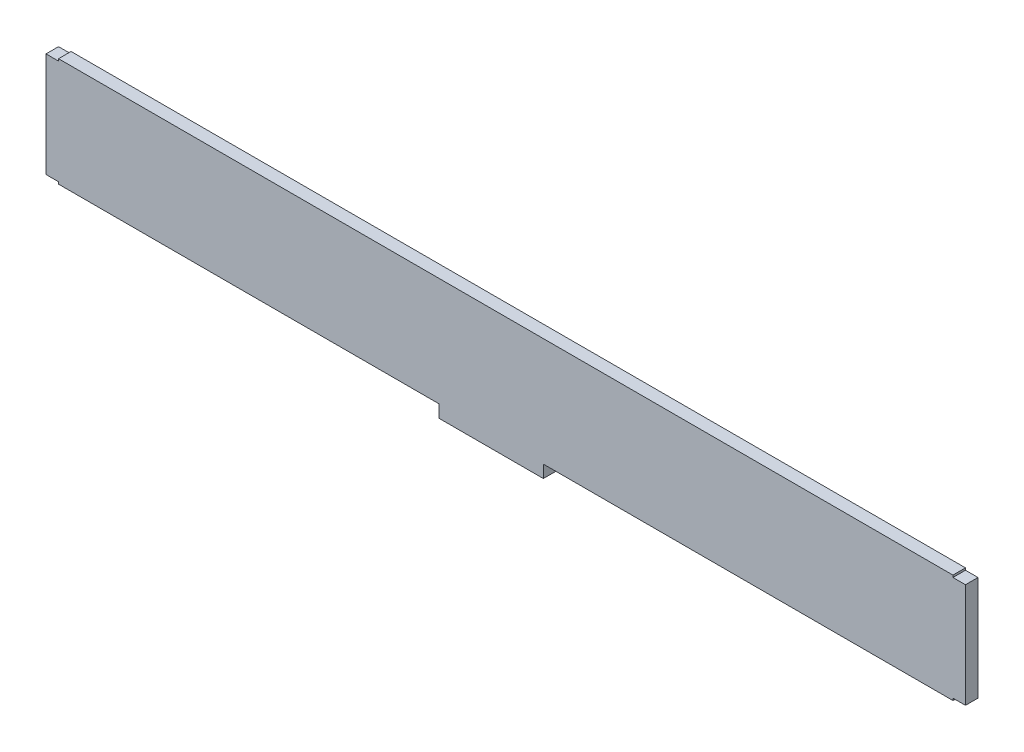
ISO-10303-21;
HEADER;
FILE_DESCRIPTION(('STEP AP214'),'2;1');
FILE_NAME('part.step','',(''),(''),'','','');
FILE_SCHEMA(('AUTOMOTIVE_DESIGN { 1 0 10303 214 1 1 1 1 }'));
ENDSEC;
DATA;
#1=APPLICATION_CONTEXT('core data for automotive mechanical design processes');
#2=APPLICATION_PROTOCOL_DEFINITION('international standard','automotive_design',2000,#1);
#3=PRODUCT_CONTEXT('',#1,'mechanical');
#4=PRODUCT('Part','Part','',(#3));
#5=PRODUCT_RELATED_PRODUCT_CATEGORY('part','',(#4));
#6=PRODUCT_DEFINITION_FORMATION('','',#4);
#7=PRODUCT_DEFINITION_CONTEXT('part definition',#1,'design');
#8=PRODUCT_DEFINITION('design','',#6,#7);
#9=PRODUCT_DEFINITION_SHAPE('','',#8);
#10=(LENGTH_UNIT() NAMED_UNIT(*) SI_UNIT(.MILLI.,.METRE.));
#11=(NAMED_UNIT(*) PLANE_ANGLE_UNIT() SI_UNIT($,.RADIAN.));
#12=(NAMED_UNIT(*) SI_UNIT($,.STERADIAN.) SOLID_ANGLE_UNIT());
#13=UNCERTAINTY_MEASURE_WITH_UNIT(LENGTH_MEASURE(1.E-05),#10,'distance_accuracy_value','');
#14=(GEOMETRIC_REPRESENTATION_CONTEXT(3) GLOBAL_UNCERTAINTY_ASSIGNED_CONTEXT((#13)) GLOBAL_UNIT_ASSIGNED_CONTEXT((#10,
#11,#12)) REPRESENTATION_CONTEXT('',''));
#15=CARTESIAN_POINT('',(0.,0.,0.));
#16=DIRECTION('',(0.,0.,1.));
#17=DIRECTION('',(1.,0.,0.));
#18=AXIS2_PLACEMENT_3D('',#15,#16,#17);
#19=CARTESIAN_POINT('',(0.,0.,6.));
#20=DIRECTION('',(1.,0.,0.));
#21=DIRECTION('',(0.,0.,-1.));
#22=AXIS2_PLACEMENT_3D('',#19,#20,#21);
#23=PLANE('',#22);
#24=DIRECTION('',(0.,-1.,0.));
#25=VECTOR('',#24,1.);
#26=CARTESIAN_POINT('',(0.,0.,0.));
#27=LINE('',#26,#25);
#28=CARTESIAN_POINT('',(0.,0.,0.));
#29=VERTEX_POINT('',#28);
#30=CARTESIAN_POINT('',(0.,-0.999999999999997,0.));
#31=VERTEX_POINT('',#30);
#32=EDGE_CURVE('E179',#29,#31,#27,.T.);
#33=ORIENTED_EDGE('',*,*,#32,.T.);
#34=DIRECTION('',(0.,0.,-1.));
#35=VECTOR('',#34,1.);
#36=CARTESIAN_POINT('',(0.,-0.999999999999997,6.));
#37=LINE('',#36,#35);
#38=CARTESIAN_POINT('',(0.,-0.999999999999997,6.));
#39=VERTEX_POINT('',#38);
#40=EDGE_CURVE('E11',#39,#31,#37,.T.);
#41=ORIENTED_EDGE('',*,*,#40,.F.);
#42=DIRECTION('',(0.,-1.,0.));
#43=VECTOR('',#42,1.);
#44=CARTESIAN_POINT('',(0.,0.,6.));
#45=LINE('',#44,#43);
#46=CARTESIAN_POINT('',(0.,0.,6.));
#47=VERTEX_POINT('',#46);
#48=EDGE_CURVE('E209',#47,#39,#45,.T.);
#49=ORIENTED_EDGE('',*,*,#48,.F.);
#50=DIRECTION('',(0.,0.,-1.));
#51=VECTOR('',#50,1.);
#52=CARTESIAN_POINT('',(0.,0.,6.));
#53=LINE('',#52,#51);
#54=EDGE_CURVE('E175',#47,#29,#53,.T.);
#55=ORIENTED_EDGE('',*,*,#54,.T.);
#56=EDGE_LOOP('',(#33,#41,#49,#55));
#57=FACE_BOUND('',#56,.T.);
#58=ADVANCED_FACE('F35',(#57),#23,.F.);
#59=CARTESIAN_POINT('',(-5.99999999999999,-0.999999999999945,6.));
#60=DIRECTION('',(0.,-1.,0.));
#61=DIRECTION('',(1.,0.,0.));
#62=AXIS2_PLACEMENT_3D('',#59,#60,#61);
#63=PLANE('',#62);
#64=DIRECTION('',(-1.,0.,0.));
#65=VECTOR('',#64,1.);
#66=CARTESIAN_POINT('',(-5.99999999999999,-0.999999999999945,0.));
#67=LINE('',#66,#65);
#68=CARTESIAN_POINT('',(-5.99999999999999,-0.999999999999945,0.));
#69=VERTEX_POINT('',#68);
#70=EDGE_CURVE('E182',#31,#69,#67,.T.);
#71=ORIENTED_EDGE('',*,*,#70,.T.);
#72=DIRECTION('',(0.,0.,-1.));
#73=VECTOR('',#72,1.);
#74=CARTESIAN_POINT('',(-5.99999999999999,-0.999999999999945,6.));
#75=LINE('',#74,#73);
#76=CARTESIAN_POINT('',(-5.99999999999999,-0.999999999999945,6.));
#77=VERTEX_POINT('',#76);
#78=EDGE_CURVE('E43',#77,#69,#75,.T.);
#79=ORIENTED_EDGE('',*,*,#78,.F.);
#80=DIRECTION('',(-1.,0.,0.));
#81=VECTOR('',#80,1.);
#82=CARTESIAN_POINT('',(-5.99999999999999,-0.999999999999945,6.));
#83=LINE('',#82,#81);
#84=EDGE_CURVE('E118',#39,#77,#83,.T.);
#85=ORIENTED_EDGE('',*,*,#84,.F.);
#86=ORIENTED_EDGE('',*,*,#40,.T.);
#87=EDGE_LOOP('',(#71,#79,#85,#86));
#88=FACE_BOUND('',#87,.T.);
#89=ADVANCED_FACE('F307',(#88),#63,.F.);
#90=CARTESIAN_POINT('',(-5.99999999999999,-0.999999999999945,6.));
#91=DIRECTION('',(1.,0.,0.));
#92=DIRECTION('',(0.,1.,0.));
#93=AXIS2_PLACEMENT_3D('',#90,#91,#92);
#94=PLANE('',#93);
#95=DIRECTION('',(0.,-1.,0.));
#96=VECTOR('',#95,1.);
#97=CARTESIAN_POINT('',(-5.99999999999999,-0.999999999999945,0.));
#98=LINE('',#97,#96);
#99=CARTESIAN_POINT('',(-5.99999999999999,-51.,0.));
#100=VERTEX_POINT('',#99);
#101=EDGE_CURVE('E184',#69,#100,#98,.T.);
#102=ORIENTED_EDGE('',*,*,#101,.T.);
#103=DIRECTION('',(0.,0.,-1.));
#104=VECTOR('',#103,1.);
#105=CARTESIAN_POINT('',(-5.99999999999999,-51.,6.));
#106=LINE('',#105,#104);
#107=CARTESIAN_POINT('',(-5.99999999999999,-51.,6.));
#108=VERTEX_POINT('',#107);
#109=EDGE_CURVE('E240',#108,#100,#106,.T.);
#110=ORIENTED_EDGE('',*,*,#109,.F.);
#111=DIRECTION('',(0.,-1.,0.));
#112=VECTOR('',#111,1.);
#113=CARTESIAN_POINT('',(-5.99999999999999,-0.999999999999945,6.));
#114=LINE('',#113,#112);
#115=EDGE_CURVE('E248',#77,#108,#114,.T.);
#116=ORIENTED_EDGE('',*,*,#115,.F.);
#117=ORIENTED_EDGE('',*,*,#78,.T.);
#118=EDGE_LOOP('',(#102,#110,#116,#117));
#119=FACE_BOUND('',#118,.T.);
#120=ADVANCED_FACE('F246',(#119),#94,.F.);
#121=CARTESIAN_POINT('',(-5.99999999999999,-51.,6.));
#122=DIRECTION('',(0.,1.,0.));
#123=DIRECTION('',(-1.,0.,0.));
#124=AXIS2_PLACEMENT_3D('',#121,#122,#123);
#125=PLANE('',#124);
#126=DIRECTION('',(1.,0.,0.));
#127=VECTOR('',#126,1.);
#128=CARTESIAN_POINT('',(-5.99999999999999,-51.,0.));
#129=LINE('',#128,#127);
#130=CARTESIAN_POINT('',(0.,-51.,0.));
#131=VERTEX_POINT('',#130);
#132=EDGE_CURVE('E186',#100,#131,#129,.T.);
#133=ORIENTED_EDGE('',*,*,#132,.T.);
#134=DIRECTION('',(0.,0.,-1.));
#135=VECTOR('',#134,1.);
#136=CARTESIAN_POINT('',(0.,-51.,6.));
#137=LINE('',#136,#135);
#138=CARTESIAN_POINT('',(0.,-51.,6.));
#139=VERTEX_POINT('',#138);
#140=EDGE_CURVE('E237',#139,#131,#137,.T.);
#141=ORIENTED_EDGE('',*,*,#140,.F.);
#142=DIRECTION('',(1.,0.,0.));
#143=VECTOR('',#142,1.);
#144=CARTESIAN_POINT('',(-5.99999999999999,-51.,6.));
#145=LINE('',#144,#143);
#146=EDGE_CURVE('E266',#108,#139,#145,.T.);
#147=ORIENTED_EDGE('',*,*,#146,.F.);
#148=ORIENTED_EDGE('',*,*,#109,.T.);
#149=EDGE_LOOP('',(#133,#141,#147,#148));
#150=FACE_BOUND('',#149,.T.);
#151=ADVANCED_FACE('F257',(#150),#125,.F.);
#152=CARTESIAN_POINT('',(0.,-51.,6.));
#153=DIRECTION('',(1.,1.19594830056547E-13,0.));
#154=DIRECTION('',(-1.19594830056547E-13,1.,0.));
#155=AXIS2_PLACEMENT_3D('',#152,#153,#154);
#156=PLANE('',#155);
#157=DIRECTION('',(1.19594830056547E-13,-1.,0.));
#158=VECTOR('',#157,1.);
#159=CARTESIAN_POINT('',(0.,-51.,0.));
#160=LINE('',#159,#158);
#161=CARTESIAN_POINT('',(0.,-52.,0.));
#162=VERTEX_POINT('',#161);
#163=EDGE_CURVE('E188',#131,#162,#160,.T.);
#164=ORIENTED_EDGE('',*,*,#163,.T.);
#165=DIRECTION('',(0.,0.,-1.));
#166=VECTOR('',#165,1.);
#167=CARTESIAN_POINT('',(0.,-52.,6.));
#168=LINE('',#167,#166);
#169=CARTESIAN_POINT('',(0.,-52.,6.));
#170=VERTEX_POINT('',#169);
#171=EDGE_CURVE('E234',#170,#162,#168,.T.);
#172=ORIENTED_EDGE('',*,*,#171,.F.);
#173=DIRECTION('',(1.19594830056547E-13,-1.,0.));
#174=VECTOR('',#173,1.);
#175=CARTESIAN_POINT('',(0.,-51.,6.));
#176=LINE('',#175,#174);
#177=EDGE_CURVE('E263',#139,#170,#176,.T.);
#178=ORIENTED_EDGE('',*,*,#177,.F.);
#179=ORIENTED_EDGE('',*,*,#140,.T.);
#180=EDGE_LOOP('',(#164,#172,#178,#179));
#181=FACE_BOUND('',#180,.T.);
#182=ADVANCED_FACE('F261',(#181),#156,.F.);
#183=CARTESIAN_POINT('',(0.,-52.,6.));
#184=DIRECTION('',(0.,1.,0.));
#185=DIRECTION('',(0.,0.,1.));
#186=AXIS2_PLACEMENT_3D('',#183,#184,#185);
#187=PLANE('',#186);
#188=DIRECTION('',(1.,0.,0.));
#189=VECTOR('',#188,1.);
#190=CARTESIAN_POINT('',(0.,-52.,0.));
#191=LINE('',#190,#189);
#192=CARTESIAN_POINT('',(182.,-52.,0.));
#193=VERTEX_POINT('',#192);
#194=EDGE_CURVE('E190',#162,#193,#191,.T.);
#195=ORIENTED_EDGE('',*,*,#194,.T.);
#196=DIRECTION('',(0.,0.,-1.));
#197=VECTOR('',#196,1.);
#198=CARTESIAN_POINT('',(182.,-52.,6.));
#199=LINE('',#198,#197);
#200=CARTESIAN_POINT('',(182.,-52.,6.));
#201=VERTEX_POINT('',#200);
#202=EDGE_CURVE('E231',#201,#193,#199,.T.);
#203=ORIENTED_EDGE('',*,*,#202,.F.);
#204=DIRECTION('',(1.,0.,0.));
#205=VECTOR('',#204,1.);
#206=CARTESIAN_POINT('',(0.,-52.,6.));
#207=LINE('',#206,#205);
#208=EDGE_CURVE('E265',#170,#201,#207,.T.);
#209=ORIENTED_EDGE('',*,*,#208,.F.);
#210=ORIENTED_EDGE('',*,*,#171,.T.);
#211=EDGE_LOOP('',(#195,#203,#209,#210));
#212=FACE_BOUND('',#211,.T.);
#213=ADVANCED_FACE('F320',(#212),#187,.F.);
#214=CARTESIAN_POINT('',(182.,-52.,6.));
#215=DIRECTION('',(1.,0.,0.));
#216=DIRECTION('',(0.,0.,-1.));
#217=AXIS2_PLACEMENT_3D('',#214,#215,#216);
#218=PLANE('',#217);
#219=DIRECTION('',(0.,-1.,0.));
#220=VECTOR('',#219,1.);
#221=CARTESIAN_POINT('',(182.,-52.,0.));
#222=LINE('',#221,#220);
#223=CARTESIAN_POINT('',(182.,-58.,0.));
#224=VERTEX_POINT('',#223);
#225=EDGE_CURVE('E192',#193,#224,#222,.T.);
#226=ORIENTED_EDGE('',*,*,#225,.T.);
#227=DIRECTION('',(0.,0.,-1.));
#228=VECTOR('',#227,1.);
#229=CARTESIAN_POINT('',(182.,-58.,6.));
#230=LINE('',#229,#228);
#231=CARTESIAN_POINT('',(182.,-58.,6.));
#232=VERTEX_POINT('',#231);
#233=EDGE_CURVE('E228',#232,#224,#230,.T.);
#234=ORIENTED_EDGE('',*,*,#233,.F.);
#235=DIRECTION('',(0.,-1.,0.));
#236=VECTOR('',#235,1.);
#237=CARTESIAN_POINT('',(182.,-52.,6.));
#238=LINE('',#237,#236);
#239=EDGE_CURVE('E268',#201,#232,#238,.T.);
#240=ORIENTED_EDGE('',*,*,#239,.F.);
#241=ORIENTED_EDGE('',*,*,#202,.T.);
#242=EDGE_LOOP('',(#226,#234,#240,#241));
#243=FACE_BOUND('',#242,.T.);
#244=ADVANCED_FACE('F323',(#243),#218,.F.);
#245=CARTESIAN_POINT('',(182.,-58.,6.));
#246=DIRECTION('',(0.,1.,0.));
#247=DIRECTION('',(0.,0.,1.));
#248=AXIS2_PLACEMENT_3D('',#245,#246,#247);
#249=PLANE('',#248);
#250=DIRECTION('',(1.,0.,0.));
#251=VECTOR('',#250,1.);
#252=CARTESIAN_POINT('',(182.,-58.,0.));
#253=LINE('',#252,#251);
#254=CARTESIAN_POINT('',(232.,-58.,0.));
#255=VERTEX_POINT('',#254);
#256=EDGE_CURVE('E194',#224,#255,#253,.T.);
#257=ORIENTED_EDGE('',*,*,#256,.T.);
#258=DIRECTION('',(0.,0.,-1.));
#259=VECTOR('',#258,1.);
#260=CARTESIAN_POINT('',(232.,-58.,6.));
#261=LINE('',#260,#259);
#262=CARTESIAN_POINT('',(232.,-58.,6.));
#263=VERTEX_POINT('',#262);
#264=EDGE_CURVE('E225',#263,#255,#261,.T.);
#265=ORIENTED_EDGE('',*,*,#264,.F.);
#266=DIRECTION('',(1.,0.,0.));
#267=VECTOR('',#266,1.);
#268=CARTESIAN_POINT('',(182.,-58.,6.));
#269=LINE('',#268,#267);
#270=EDGE_CURVE('E274',#232,#263,#269,.T.);
#271=ORIENTED_EDGE('',*,*,#270,.F.);
#272=ORIENTED_EDGE('',*,*,#233,.T.);
#273=EDGE_LOOP('',(#257,#265,#271,#272));
#274=FACE_BOUND('',#273,.T.);
#275=ADVANCED_FACE('F327',(#274),#249,.F.);
#276=CARTESIAN_POINT('',(232.,-52.,6.));
#277=DIRECTION('',(-1.,0.,0.));
#278=DIRECTION('',(0.,0.,1.));
#279=AXIS2_PLACEMENT_3D('',#276,#277,#278);
#280=PLANE('',#279);
#281=DIRECTION('',(0.,1.,0.));
#282=VECTOR('',#281,1.);
#283=CARTESIAN_POINT('',(232.,-52.,0.));
#284=LINE('',#283,#282);
#285=CARTESIAN_POINT('',(232.,-52.,0.));
#286=VERTEX_POINT('',#285);
#287=EDGE_CURVE('E196',#255,#286,#284,.T.);
#288=ORIENTED_EDGE('',*,*,#287,.T.);
#289=DIRECTION('',(0.,0.,-1.));
#290=VECTOR('',#289,1.);
#291=CARTESIAN_POINT('',(232.,-52.,6.));
#292=LINE('',#291,#290);
#293=CARTESIAN_POINT('',(232.,-52.,6.));
#294=VERTEX_POINT('',#293);
#295=EDGE_CURVE('E222',#294,#286,#292,.T.);
#296=ORIENTED_EDGE('',*,*,#295,.F.);
#297=DIRECTION('',(0.,1.,0.));
#298=VECTOR('',#297,1.);
#299=CARTESIAN_POINT('',(232.,-52.,6.));
#300=LINE('',#299,#298);
#301=EDGE_CURVE('E276',#263,#294,#300,.T.);
#302=ORIENTED_EDGE('',*,*,#301,.F.);
#303=ORIENTED_EDGE('',*,*,#264,.T.);
#304=EDGE_LOOP('',(#288,#296,#302,#303));
#305=FACE_BOUND('',#304,.T.);
#306=ADVANCED_FACE('F331',(#305),#280,.F.);
#307=CARTESIAN_POINT('',(232.,-52.,6.));
#308=DIRECTION('',(0.,1.,0.));
#309=DIRECTION('',(-1.,0.,0.));
#310=AXIS2_PLACEMENT_3D('',#307,#308,#309);
#311=PLANE('',#310);
#312=DIRECTION('',(1.,0.,0.));
#313=VECTOR('',#312,1.);
#314=CARTESIAN_POINT('',(232.,-52.,0.));
#315=LINE('',#314,#313);
#316=CARTESIAN_POINT('',(428.,-52.,0.));
#317=VERTEX_POINT('',#316);
#318=EDGE_CURVE('E198',#286,#317,#315,.T.);
#319=ORIENTED_EDGE('',*,*,#318,.T.);
#320=DIRECTION('',(0.,0.,-1.));
#321=VECTOR('',#320,1.);
#322=CARTESIAN_POINT('',(428.,-52.,6.));
#323=LINE('',#322,#321);
#324=CARTESIAN_POINT('',(428.,-52.,6.));
#325=VERTEX_POINT('',#324);
#326=EDGE_CURVE('E219',#325,#317,#323,.T.);
#327=ORIENTED_EDGE('',*,*,#326,.F.);
#328=DIRECTION('',(1.,0.,0.));
#329=VECTOR('',#328,1.);
#330=CARTESIAN_POINT('',(232.,-52.,6.));
#331=LINE('',#330,#329);
#332=EDGE_CURVE('E278',#294,#325,#331,.T.);
#333=ORIENTED_EDGE('',*,*,#332,.F.);
#334=ORIENTED_EDGE('',*,*,#295,.T.);
#335=EDGE_LOOP('',(#319,#327,#333,#334));
#336=FACE_BOUND('',#335,.T.);
#337=ADVANCED_FACE('F335',(#336),#311,.F.);
#338=CARTESIAN_POINT('',(428.,-51.,6.));
#339=DIRECTION('',(-1.,0.,0.));
#340=DIRECTION('',(0.,0.,1.));
#341=AXIS2_PLACEMENT_3D('',#338,#339,#340);
#342=PLANE('',#341);
#343=DIRECTION('',(0.,1.,0.));
#344=VECTOR('',#343,1.);
#345=CARTESIAN_POINT('',(428.,-51.,0.));
#346=LINE('',#345,#344);
#347=CARTESIAN_POINT('',(428.,-51.,0.));
#348=VERTEX_POINT('',#347);
#349=EDGE_CURVE('E200',#317,#348,#346,.T.);
#350=ORIENTED_EDGE('',*,*,#349,.T.);
#351=DIRECTION('',(0.,0.,-1.));
#352=VECTOR('',#351,1.);
#353=CARTESIAN_POINT('',(428.,-51.,6.));
#354=LINE('',#353,#352);
#355=CARTESIAN_POINT('',(428.,-51.,6.));
#356=VERTEX_POINT('',#355);
#357=EDGE_CURVE('E216',#356,#348,#354,.T.);
#358=ORIENTED_EDGE('',*,*,#357,.F.);
#359=DIRECTION('',(0.,1.,0.));
#360=VECTOR('',#359,1.);
#361=CARTESIAN_POINT('',(428.,-51.,6.));
#362=LINE('',#361,#360);
#363=EDGE_CURVE('E280',#325,#356,#362,.T.);
#364=ORIENTED_EDGE('',*,*,#363,.F.);
#365=ORIENTED_EDGE('',*,*,#326,.T.);
#366=EDGE_LOOP('',(#350,#358,#364,#365));
#367=FACE_BOUND('',#366,.T.);
#368=ADVANCED_FACE('F339',(#367),#342,.F.);
#369=CARTESIAN_POINT('',(434.,-50.9999999999999,6.));
#370=DIRECTION('',(0.,1.,0.));
#371=DIRECTION('',(-1.,0.,0.));
#372=AXIS2_PLACEMENT_3D('',#369,#370,#371);
#373=PLANE('',#372);
#374=DIRECTION('',(1.,0.,0.));
#375=VECTOR('',#374,1.);
#376=CARTESIAN_POINT('',(434.,-50.9999999999999,0.));
#377=LINE('',#376,#375);
#378=CARTESIAN_POINT('',(434.,-50.9999999999999,0.));
#379=VERTEX_POINT('',#378);
#380=EDGE_CURVE('E202',#348,#379,#377,.T.);
#381=ORIENTED_EDGE('',*,*,#380,.T.);
#382=DIRECTION('',(0.,0.,-1.));
#383=VECTOR('',#382,1.);
#384=CARTESIAN_POINT('',(434.,-50.9999999999999,6.));
#385=LINE('',#384,#383);
#386=CARTESIAN_POINT('',(434.,-50.9999999999999,6.));
#387=VERTEX_POINT('',#386);
#388=EDGE_CURVE('E213',#387,#379,#385,.T.);
#389=ORIENTED_EDGE('',*,*,#388,.F.);
#390=DIRECTION('',(1.,0.,0.));
#391=VECTOR('',#390,1.);
#392=CARTESIAN_POINT('',(434.,-50.9999999999999,6.));
#393=LINE('',#392,#391);
#394=EDGE_CURVE('E282',#356,#387,#393,.T.);
#395=ORIENTED_EDGE('',*,*,#394,.F.);
#396=ORIENTED_EDGE('',*,*,#357,.T.);
#397=EDGE_LOOP('',(#381,#389,#395,#396));
#398=FACE_BOUND('',#397,.T.);
#399=ADVANCED_FACE('F288',(#398),#373,.F.);
#400=CARTESIAN_POINT('',(434.,-0.999999999999892,6.));
#401=DIRECTION('',(-1.,0.,0.));
#402=DIRECTION('',(0.,-1.,0.));
#403=AXIS2_PLACEMENT_3D('',#400,#401,#402);
#404=PLANE('',#403);
#405=DIRECTION('',(0.,1.,0.));
#406=VECTOR('',#405,1.);
#407=CARTESIAN_POINT('',(434.,-0.999999999999892,0.));
#408=LINE('',#407,#406);
#409=CARTESIAN_POINT('',(434.,-0.999999999999892,0.));
#410=VERTEX_POINT('',#409);
#411=EDGE_CURVE('E204',#379,#410,#408,.T.);
#412=ORIENTED_EDGE('',*,*,#411,.T.);
#413=DIRECTION('',(0.,0.,-1.));
#414=VECTOR('',#413,1.);
#415=CARTESIAN_POINT('',(434.,-0.999999999999892,6.));
#416=LINE('',#415,#414);
#417=CARTESIAN_POINT('',(434.,-0.999999999999892,6.));
#418=VERTEX_POINT('',#417);
#419=EDGE_CURVE('E170',#418,#410,#416,.T.);
#420=ORIENTED_EDGE('',*,*,#419,.F.);
#421=DIRECTION('',(0.,1.,0.));
#422=VECTOR('',#421,1.);
#423=CARTESIAN_POINT('',(434.,-0.999999999999892,6.));
#424=LINE('',#423,#422);
#425=EDGE_CURVE('E161',#387,#418,#424,.T.);
#426=ORIENTED_EDGE('',*,*,#425,.F.);
#427=ORIENTED_EDGE('',*,*,#388,.T.);
#428=EDGE_LOOP('',(#412,#420,#426,#427));
#429=FACE_BOUND('',#428,.T.);
#430=ADVANCED_FACE('F292',(#429),#404,.F.);
#431=CARTESIAN_POINT('',(434.,-0.999999999999892,6.));
#432=DIRECTION('',(0.,-1.,0.));
#433=DIRECTION('',(1.,0.,0.));
#434=AXIS2_PLACEMENT_3D('',#431,#432,#433);
#435=PLANE('',#434);
#436=DIRECTION('',(-1.,0.,0.));
#437=VECTOR('',#436,1.);
#438=CARTESIAN_POINT('',(434.,-0.999999999999892,0.));
#439=LINE('',#438,#437);
#440=CARTESIAN_POINT('',(428.,-0.999999999999945,0.));
#441=VERTEX_POINT('',#440);
#442=EDGE_CURVE('E169',#410,#441,#439,.T.);
#443=ORIENTED_EDGE('',*,*,#442,.T.);
#444=DIRECTION('',(0.,0.,-1.));
#445=VECTOR('',#444,1.);
#446=CARTESIAN_POINT('',(428.,-0.999999999999945,6.));
#447=LINE('',#446,#445);
#448=CARTESIAN_POINT('',(428.,-0.999999999999945,6.));
#449=VERTEX_POINT('',#448);
#450=EDGE_CURVE('E166',#449,#441,#447,.T.);
#451=ORIENTED_EDGE('',*,*,#450,.F.);
#452=DIRECTION('',(-1.,0.,0.));
#453=VECTOR('',#452,1.);
#454=CARTESIAN_POINT('',(434.,-0.999999999999892,6.));
#455=LINE('',#454,#453);
#456=EDGE_CURVE('E155',#418,#449,#455,.T.);
#457=ORIENTED_EDGE('',*,*,#456,.F.);
#458=ORIENTED_EDGE('',*,*,#419,.T.);
#459=EDGE_LOOP('',(#443,#451,#457,#458));
#460=FACE_BOUND('',#459,.T.);
#461=ADVANCED_FACE('F167',(#460),#435,.F.);
#462=CARTESIAN_POINT('',(428.,0.,6.));
#463=DIRECTION('',(-1.,0.,0.));
#464=DIRECTION('',(0.,0.,1.));
#465=AXIS2_PLACEMENT_3D('',#462,#463,#464);
#466=PLANE('',#465);
#467=DIRECTION('',(0.,1.,0.));
#468=VECTOR('',#467,1.);
#469=CARTESIAN_POINT('',(428.,0.,0.));
#470=LINE('',#469,#468);
#471=CARTESIAN_POINT('',(428.,0.,0.));
#472=VERTEX_POINT('',#471);
#473=EDGE_CURVE('E104',#441,#472,#470,.T.);
#474=ORIENTED_EDGE('',*,*,#473,.T.);
#475=DIRECTION('',(0.,0.,-1.));
#476=VECTOR('',#475,1.);
#477=CARTESIAN_POINT('',(428.,0.,6.));
#478=LINE('',#477,#476);
#479=CARTESIAN_POINT('',(428.,0.,6.));
#480=VERTEX_POINT('',#479);
#481=EDGE_CURVE('E171',#480,#472,#478,.T.);
#482=ORIENTED_EDGE('',*,*,#481,.F.);
#483=DIRECTION('',(0.,1.,0.));
#484=VECTOR('',#483,1.);
#485=CARTESIAN_POINT('',(428.,0.,6.));
#486=LINE('',#485,#484);
#487=EDGE_CURVE('E159',#449,#480,#486,.T.);
#488=ORIENTED_EDGE('',*,*,#487,.F.);
#489=ORIENTED_EDGE('',*,*,#450,.T.);
#490=EDGE_LOOP('',(#474,#482,#488,#489));
#491=FACE_BOUND('',#490,.T.);
#492=ADVANCED_FACE('F173',(#491),#466,.F.);
#493=CARTESIAN_POINT('',(0.,0.,6.));
#494=DIRECTION('',(0.,-1.,0.));
#495=DIRECTION('',(1.,0.,0.));
#496=AXIS2_PLACEMENT_3D('',#493,#494,#495);
#497=PLANE('',#496);
#498=DIRECTION('',(-1.,0.,0.));
#499=VECTOR('',#498,1.);
#500=CARTESIAN_POINT('',(0.,0.,0.));
#501=LINE('',#500,#499);
#502=EDGE_CURVE('E110',#472,#29,#501,.T.);
#503=ORIENTED_EDGE('',*,*,#502,.T.);
#504=ORIENTED_EDGE('',*,*,#54,.F.);
#505=DIRECTION('',(-1.,0.,0.));
#506=VECTOR('',#505,1.);
#507=CARTESIAN_POINT('',(0.,0.,6.));
#508=LINE('',#507,#506);
#509=EDGE_CURVE('E51',#480,#47,#508,.T.);
#510=ORIENTED_EDGE('',*,*,#509,.F.);
#511=ORIENTED_EDGE('',*,*,#481,.T.);
#512=EDGE_LOOP('',(#503,#504,#510,#511));
#513=FACE_BOUND('',#512,.T.);
#514=ADVANCED_FACE('F296',(#513),#497,.F.);
#515=CARTESIAN_POINT('',(0.,0.,6.));
#516=DIRECTION('',(0.,0.,1.));
#517=DIRECTION('',(1.,0.,0.));
#518=AXIS2_PLACEMENT_3D('',#515,#516,#517);
#519=PLANE('',#518);
#520=ORIENTED_EDGE('',*,*,#48,.T.);
#521=ORIENTED_EDGE('',*,*,#84,.T.);
#522=ORIENTED_EDGE('',*,*,#115,.T.);
#523=ORIENTED_EDGE('',*,*,#146,.T.);
#524=ORIENTED_EDGE('',*,*,#177,.T.);
#525=ORIENTED_EDGE('',*,*,#208,.T.);
#526=ORIENTED_EDGE('',*,*,#239,.T.);
#527=ORIENTED_EDGE('',*,*,#270,.T.);
#528=ORIENTED_EDGE('',*,*,#301,.T.);
#529=ORIENTED_EDGE('',*,*,#332,.T.);
#530=ORIENTED_EDGE('',*,*,#363,.T.);
#531=ORIENTED_EDGE('',*,*,#394,.T.);
#532=ORIENTED_EDGE('',*,*,#425,.T.);
#533=ORIENTED_EDGE('',*,*,#456,.T.);
#534=ORIENTED_EDGE('',*,*,#487,.T.);
#535=ORIENTED_EDGE('',*,*,#509,.T.);
#536=EDGE_LOOP('',(#520,#521,#522,#523,#524,#525,#526,#527,#528,#529,#530,#531,#532,#533,#534,#535));
#537=FACE_BOUND('',#536,.T.);
#538=ADVANCED_FACE('F157',(#537),#519,.T.);
#539=CARTESIAN_POINT('',(0.,0.,0.));
#540=DIRECTION('',(0.,0.,1.));
#541=DIRECTION('',(1.,0.,0.));
#542=AXIS2_PLACEMENT_3D('',#539,#540,#541);
#543=PLANE('',#542);
#544=ORIENTED_EDGE('',*,*,#32,.F.);
#545=ORIENTED_EDGE('',*,*,#502,.F.);
#546=ORIENTED_EDGE('',*,*,#473,.F.);
#547=ORIENTED_EDGE('',*,*,#442,.F.);
#548=ORIENTED_EDGE('',*,*,#411,.F.);
#549=ORIENTED_EDGE('',*,*,#380,.F.);
#550=ORIENTED_EDGE('',*,*,#349,.F.);
#551=ORIENTED_EDGE('',*,*,#318,.F.);
#552=ORIENTED_EDGE('',*,*,#287,.F.);
#553=ORIENTED_EDGE('',*,*,#256,.F.);
#554=ORIENTED_EDGE('',*,*,#225,.F.);
#555=ORIENTED_EDGE('',*,*,#194,.F.);
#556=ORIENTED_EDGE('',*,*,#163,.F.);
#557=ORIENTED_EDGE('',*,*,#132,.F.);
#558=ORIENTED_EDGE('',*,*,#101,.F.);
#559=ORIENTED_EDGE('',*,*,#70,.F.);
#560=EDGE_LOOP('',(#544,#545,#546,#547,#548,#549,#550,#551,#552,#553,#554,#555,#556,#557,#558,#559));
#561=FACE_BOUND('',#560,.T.);
#562=ADVANCED_FACE('F252',(#561),#543,.F.);
#563=CLOSED_SHELL('',(#58,#89,#120,#151,#182,#213,#244,#275,#306,#337,#368,#399,#430,#461,#492,
#514,#538,#562));
#564=MANIFOLD_SOLID_BREP('B2',#563);
#565=ADVANCED_BREP_SHAPE_REPRESENTATION('',(#18,#564),#14);
#566=SHAPE_DEFINITION_REPRESENTATION(#9,#565);
ENDSEC;
END-ISO-10303-21;
